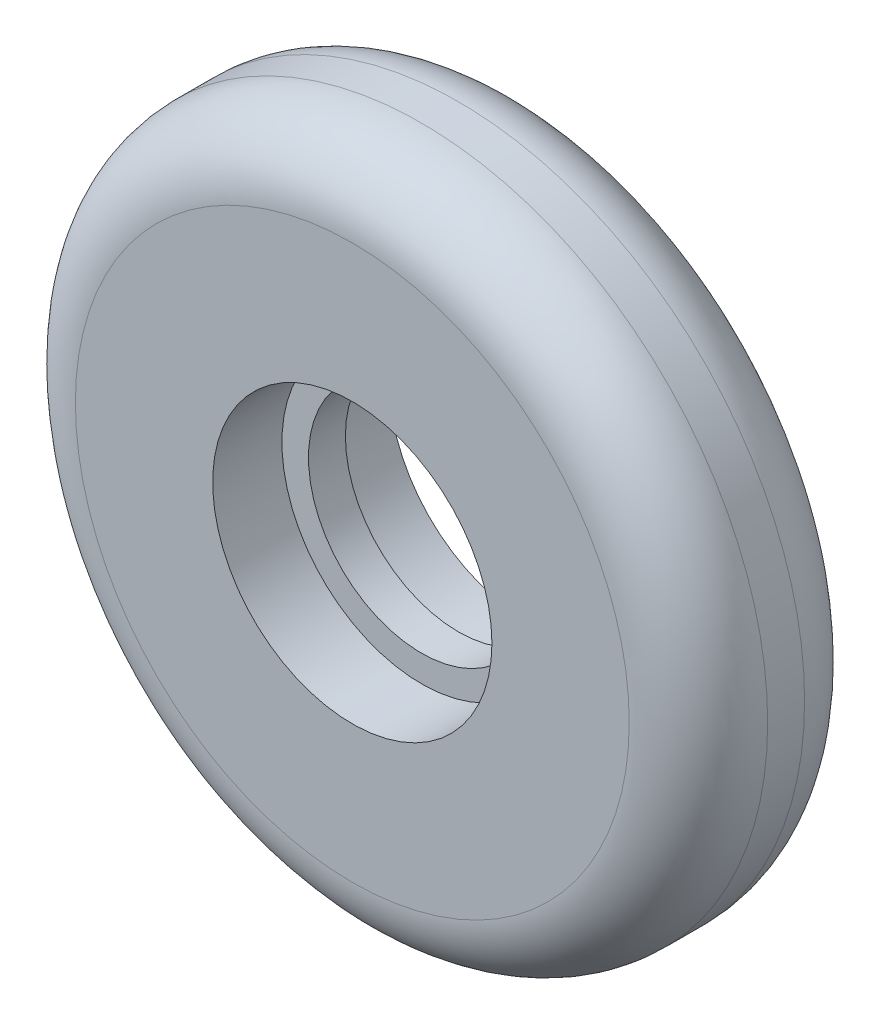
ISO-10303-21;
HEADER;
FILE_DESCRIPTION(('STEP AP214'),'2;1');
FILE_NAME('part.step','',(''),(''),'','','');
FILE_SCHEMA(('AUTOMOTIVE_DESIGN { 1 0 10303 214 1 1 1 1 }'));
ENDSEC;
DATA;
#1=APPLICATION_CONTEXT('core data for automotive mechanical design processes');
#2=APPLICATION_PROTOCOL_DEFINITION('international standard','automotive_design',2000,#1);
#3=PRODUCT_CONTEXT('',#1,'mechanical');
#4=PRODUCT('Part','Part','',(#3));
#5=PRODUCT_RELATED_PRODUCT_CATEGORY('part','',(#4));
#6=PRODUCT_DEFINITION_FORMATION('','',#4);
#7=PRODUCT_DEFINITION_CONTEXT('part definition',#1,'design');
#8=PRODUCT_DEFINITION('design','',#6,#7);
#9=PRODUCT_DEFINITION_SHAPE('','',#8);
#10=(LENGTH_UNIT() NAMED_UNIT(*) SI_UNIT(.MILLI.,.METRE.));
#11=(NAMED_UNIT(*) PLANE_ANGLE_UNIT() SI_UNIT($,.RADIAN.));
#12=(NAMED_UNIT(*) SI_UNIT($,.STERADIAN.) SOLID_ANGLE_UNIT());
#13=UNCERTAINTY_MEASURE_WITH_UNIT(LENGTH_MEASURE(1.E-05),#10,'distance_accuracy_value','');
#14=(GEOMETRIC_REPRESENTATION_CONTEXT(3) GLOBAL_UNCERTAINTY_ASSIGNED_CONTEXT((#13)) GLOBAL_UNIT_ASSIGNED_CONTEXT((#10,
#11,#12)) REPRESENTATION_CONTEXT('',''));
#15=CARTESIAN_POINT('',(0.,0.,0.));
#16=DIRECTION('',(0.,0.,1.));
#17=DIRECTION('',(1.,0.,0.));
#18=AXIS2_PLACEMENT_3D('',#15,#16,#17);
#19=CARTESIAN_POINT('',(0.,0.,7.6));
#20=DIRECTION('',(0.,0.,-1.));
#21=DIRECTION('',(-1.,0.,0.));
#22=AXIS2_PLACEMENT_3D('',#19,#20,#21);
#23=CYLINDRICAL_SURFACE('',#22,15.);
#24=CARTESIAN_POINT('',(0.,0.,3.));
#25=DIRECTION('',(0.,0.,1.));
#26=DIRECTION('',(1.,0.,0.));
#27=AXIS2_PLACEMENT_3D('',#24,#25,#26);
#28=CIRCLE('',#27,15.);
#29=CARTESIAN_POINT('',(-15.,0.,3.));
#30=VERTEX_POINT('',#29);
#31=EDGE_CURVE('E44',#30,#30,#28,.T.);
#32=CARTESIAN_POINT('',(0.,0.,4.6));
#33=DIRECTION('',(0.,0.,1.));
#34=DIRECTION('',(1.,0.,0.));
#35=AXIS2_PLACEMENT_3D('',#32,#33,#34);
#36=CIRCLE('',#35,15.);
#37=CARTESIAN_POINT('',(-15.,0.,4.6));
#38=VERTEX_POINT('',#37);
#39=EDGE_CURVE('E48',#38,#38,#36,.F.);
#40=CARTESIAN_POINT('',(-15.,0.,3.));
#41=CARTESIAN_POINT('',(-15.,0.,3.01666666666667));
#42=CARTESIAN_POINT('',(-15.,0.,3.03333333333333));
#43=CARTESIAN_POINT('',(-15.,0.,3.06666666666667));
#44=CARTESIAN_POINT('',(-15.,0.,3.08333333333333));
#45=CARTESIAN_POINT('',(-15.,0.,3.11666666666667));
#46=CARTESIAN_POINT('',(-15.,0.,3.13333333333333));
#47=CARTESIAN_POINT('',(-15.,0.,3.16666666666667));
#48=CARTESIAN_POINT('',(-15.,0.,3.18333333333333));
#49=CARTESIAN_POINT('',(-15.,0.,3.21666666666667));
#50=CARTESIAN_POINT('',(-15.,0.,3.23333333333333));
#51=CARTESIAN_POINT('',(-15.,0.,3.26666666666667));
#52=CARTESIAN_POINT('',(-15.,0.,3.28333333333333));
#53=CARTESIAN_POINT('',(-15.,0.,3.31666666666667));
#54=CARTESIAN_POINT('',(-15.,0.,3.33333333333333));
#55=CARTESIAN_POINT('',(-15.,0.,3.36666666666667));
#56=CARTESIAN_POINT('',(-15.,0.,3.38333333333333));
#57=CARTESIAN_POINT('',(-15.,0.,3.41666666666667));
#58=CARTESIAN_POINT('',(-15.,0.,3.43333333333333));
#59=CARTESIAN_POINT('',(-15.,0.,3.46666666666667));
#60=CARTESIAN_POINT('',(-15.,0.,3.48333333333333));
#61=CARTESIAN_POINT('',(-15.,0.,3.51666666666667));
#62=CARTESIAN_POINT('',(-15.,0.,3.53333333333333));
#63=CARTESIAN_POINT('',(-15.,0.,3.56666666666667));
#64=CARTESIAN_POINT('',(-15.,0.,3.58333333333333));
#65=CARTESIAN_POINT('',(-15.,0.,3.61666666666667));
#66=CARTESIAN_POINT('',(-15.,0.,3.63333333333333));
#67=CARTESIAN_POINT('',(-15.,0.,3.66666666666667));
#68=CARTESIAN_POINT('',(-15.,0.,3.68333333333333));
#69=CARTESIAN_POINT('',(-15.,0.,3.71666666666667));
#70=CARTESIAN_POINT('',(-15.,0.,3.73333333333333));
#71=CARTESIAN_POINT('',(-15.,0.,3.76666666666667));
#72=CARTESIAN_POINT('',(-15.,0.,3.78333333333333));
#73=CARTESIAN_POINT('',(-15.,0.,3.81666666666667));
#74=CARTESIAN_POINT('',(-15.,0.,3.83333333333333));
#75=CARTESIAN_POINT('',(-15.,0.,3.86666666666667));
#76=CARTESIAN_POINT('',(-15.,0.,3.88333333333333));
#77=CARTESIAN_POINT('',(-15.,0.,3.91666666666667));
#78=CARTESIAN_POINT('',(-15.,0.,3.93333333333333));
#79=CARTESIAN_POINT('',(-15.,0.,3.96666666666667));
#80=CARTESIAN_POINT('',(-15.,0.,3.98333333333333));
#81=CARTESIAN_POINT('',(-15.,0.,4.01666666666667));
#82=CARTESIAN_POINT('',(-15.,0.,4.03333333333333));
#83=CARTESIAN_POINT('',(-15.,0.,4.06666666666667));
#84=CARTESIAN_POINT('',(-15.,0.,4.08333333333333));
#85=CARTESIAN_POINT('',(-15.,0.,4.11666666666667));
#86=CARTESIAN_POINT('',(-15.,0.,4.13333333333333));
#87=CARTESIAN_POINT('',(-15.,0.,4.16666666666667));
#88=CARTESIAN_POINT('',(-15.,0.,4.18333333333333));
#89=CARTESIAN_POINT('',(-15.,0.,4.21666666666667));
#90=CARTESIAN_POINT('',(-15.,0.,4.23333333333333));
#91=CARTESIAN_POINT('',(-15.,0.,4.26666666666667));
#92=CARTESIAN_POINT('',(-15.,0.,4.28333333333333));
#93=CARTESIAN_POINT('',(-15.,0.,4.31666666666667));
#94=CARTESIAN_POINT('',(-15.,0.,4.33333333333333));
#95=CARTESIAN_POINT('',(-15.,0.,4.36666666666667));
#96=CARTESIAN_POINT('',(-15.,0.,4.38333333333333));
#97=CARTESIAN_POINT('',(-15.,0.,4.41666666666667));
#98=CARTESIAN_POINT('',(-15.,0.,4.43333333333333));
#99=CARTESIAN_POINT('',(-15.,0.,4.46666666666667));
#100=CARTESIAN_POINT('',(-15.,0.,4.48333333333333));
#101=CARTESIAN_POINT('',(-15.,0.,4.51666666666667));
#102=CARTESIAN_POINT('',(-15.,0.,4.53333333333333));
#103=CARTESIAN_POINT('',(-15.,0.,4.56666666666667));
#104=CARTESIAN_POINT('',(-15.,0.,4.58333333333333));
#105=CARTESIAN_POINT('',(-15.,0.,4.6));
#106=B_SPLINE_CURVE_WITH_KNOTS('',3,(#40,#41,#42,#43,#44,#45,#46,#47,#48,#49,#50,#51,#52,#53,
#54,#55,#56,#57,#58,#59,#60,#61,#62,#63,#64,#65,#66,#67,#68,#69,#70,#71,#72,#73,#74,#75,#76,#77,
#78,#79,#80,#81,#82,#83,#84,#85,#86,#87,#88,#89,#90,#91,#92,#93,#94,#95,#96,#97,#98,#99,#100,
#101,#102,#103,#104,#105),.UNSPECIFIED.,.F.,.F.,(4,2,2,2,2,2,2,2,2,2,2,2,2,2,2,2,2,2,2,2,2,2,2,
2,2,2,2,2,2,2,2,2,4),(0.,0.0499999999999997,0.1,0.15,0.200000000000001,0.25,0.3,0.35,0.4,0.45,
0.5,0.55,0.6,0.65,0.7,0.75,0.8,0.85,0.9,0.95,1.,1.05,1.1,1.15,1.2,1.25,1.3,1.35,1.4,1.45,1.5,
1.55,1.6),.UNSPECIFIED.);
#107=EDGE_CURVE('BSEAM33',#30,#38,#106,.T.);
#108=ORIENTED_EDGE('',*,*,#31,.T.);
#109=ORIENTED_EDGE('',*,*,#39,.T.);
#110=ORIENTED_EDGE('',*,*,#107,.T.);
#111=ORIENTED_EDGE('',*,*,#107,.F.);
#112=EDGE_LOOP('',(#108,#110,#109,#111));
#113=FACE_BOUND('',#112,.T.);
#114=ADVANCED_FACE('F33',(#113),#23,.T.);
#115=CARTESIAN_POINT('',(0.,0.,7.6));
#116=DIRECTION('',(0.,0.,1.));
#117=DIRECTION('',(1.,0.,0.));
#118=AXIS2_PLACEMENT_3D('',#115,#116,#117);
#119=PLANE('',#118);
#120=CARTESIAN_POINT('',(0.,0.,7.6));
#121=DIRECTION('',(0.,0.,1.));
#122=DIRECTION('',(1.,0.,0.));
#123=AXIS2_PLACEMENT_3D('',#120,#121,#122);
#124=CIRCLE('',#123,12.);
#125=CARTESIAN_POINT('',(12.,0.,7.6));
#126=VERTEX_POINT('',#125);
#127=EDGE_CURVE('E10',#126,#126,#124,.T.);
#128=ORIENTED_EDGE('',*,*,#127,.T.);
#129=EDGE_LOOP('',(#128));
#130=FACE_BOUND('',#129,.T.);
#131=CARTESIAN_POINT('',(0.,0.,7.6));
#132=DIRECTION('',(0.,0.,1.));
#133=DIRECTION('',(1.,0.,0.));
#134=AXIS2_PLACEMENT_3D('',#131,#132,#133);
#135=CIRCLE('',#134,6.05);
#136=CARTESIAN_POINT('',(6.05,0.,7.6));
#137=VERTEX_POINT('',#136);
#138=EDGE_CURVE('E59',#137,#137,#135,.T.);
#139=ORIENTED_EDGE('',*,*,#138,.F.);
#140=EDGE_LOOP('',(#139));
#141=FACE_BOUND('',#140,.T.);
#142=ADVANCED_FACE('F88',(#130,#141),#119,.T.);
#143=CARTESIAN_POINT('',(0.,0.,0.));
#144=DIRECTION('',(0.,0.,1.));
#145=DIRECTION('',(1.,0.,0.));
#146=AXIS2_PLACEMENT_3D('',#143,#144,#145);
#147=PLANE('',#146);
#148=CARTESIAN_POINT('',(0.,0.,0.));
#149=DIRECTION('',(0.,0.,1.));
#150=DIRECTION('',(1.,0.,0.));
#151=AXIS2_PLACEMENT_3D('',#148,#149,#150);
#152=CIRCLE('',#151,12.);
#153=CARTESIAN_POINT('',(12.,0.,0.));
#154=VERTEX_POINT('',#153);
#155=EDGE_CURVE('E40',#154,#154,#152,.F.);
#156=ORIENTED_EDGE('',*,*,#155,.T.);
#157=EDGE_LOOP('',(#156));
#158=FACE_BOUND('',#157,.T.);
#159=CARTESIAN_POINT('',(0.,0.,0.));
#160=DIRECTION('',(0.,0.,-1.));
#161=DIRECTION('',(-1.,0.,0.));
#162=AXIS2_PLACEMENT_3D('',#159,#160,#161);
#163=CIRCLE('',#162,6.);
#164=CARTESIAN_POINT('',(-6.,0.,0.));
#165=VERTEX_POINT('',#164);
#166=EDGE_CURVE('E57',#165,#165,#163,.T.);
#167=ORIENTED_EDGE('',*,*,#166,.F.);
#168=EDGE_LOOP('',(#167));
#169=FACE_BOUND('',#168,.T.);
#170=ADVANCED_FACE('F84',(#158,#169),#147,.F.);
#171=CARTESIAN_POINT('',(0.,0.,4.6));
#172=DIRECTION('',(0.,0.,1.));
#173=DIRECTION('',(1.,0.,0.));
#174=AXIS2_PLACEMENT_3D('',#171,#172,#173);
#175=CYLINDRICAL_SURFACE('',#174,6.05);
#176=CARTESIAN_POINT('',(0.,0.,4.6));
#177=DIRECTION('',(0.,0.,1.));
#178=DIRECTION('',(1.,0.,0.));
#179=AXIS2_PLACEMENT_3D('',#176,#177,#178);
#180=CIRCLE('',#179,6.05);
#181=CARTESIAN_POINT('',(6.05,0.,4.6));
#182=VERTEX_POINT('',#181);
#183=EDGE_CURVE('E53',#182,#182,#180,.T.);
#184=ORIENTED_EDGE('',*,*,#183,.F.);
#185=EDGE_LOOP('',(#184));
#186=FACE_BOUND('',#185,.T.);
#187=ORIENTED_EDGE('',*,*,#138,.T.);
#188=EDGE_LOOP('',(#187));
#189=FACE_BOUND('',#188,.T.);
#190=ADVANCED_FACE('F78',(#186,#189),#175,.F.);
#191=CARTESIAN_POINT('',(0.,0.,4.6));
#192=DIRECTION('',(0.,0.,1.));
#193=DIRECTION('',(1.,0.,0.));
#194=AXIS2_PLACEMENT_3D('',#191,#192,#193);
#195=PLANE('',#194);
#196=CARTESIAN_POINT('',(0.,0.,4.6));
#197=DIRECTION('',(0.,0.,1.));
#198=DIRECTION('',(1.,0.,0.));
#199=AXIS2_PLACEMENT_3D('',#196,#197,#198);
#200=CIRCLE('',#199,4.9);
#201=CARTESIAN_POINT('',(4.9,0.,4.6));
#202=VERTEX_POINT('',#201);
#203=EDGE_CURVE('E58',#202,#202,#200,.T.);
#204=ORIENTED_EDGE('',*,*,#203,.F.);
#205=EDGE_LOOP('',(#204));
#206=FACE_BOUND('',#205,.T.);
#207=ORIENTED_EDGE('',*,*,#183,.T.);
#208=EDGE_LOOP('',(#207));
#209=FACE_BOUND('',#208,.T.);
#210=ADVANCED_FACE('F74',(#206,#209),#195,.T.);
#211=CARTESIAN_POINT('',(0.,0.,3.));
#212=DIRECTION('',(0.,0.,-1.));
#213=DIRECTION('',(-1.,0.,0.));
#214=AXIS2_PLACEMENT_3D('',#211,#212,#213);
#215=CYLINDRICAL_SURFACE('',#214,6.);
#216=CARTESIAN_POINT('',(0.,0.,3.));
#217=DIRECTION('',(0.,0.,-1.));
#218=DIRECTION('',(-1.,0.,0.));
#219=AXIS2_PLACEMENT_3D('',#216,#217,#218);
#220=CIRCLE('',#219,6.);
#221=CARTESIAN_POINT('',(-6.,0.,3.));
#222=VERTEX_POINT('',#221);
#223=EDGE_CURVE('E62',#222,#222,#220,.T.);
#224=ORIENTED_EDGE('',*,*,#223,.F.);
#225=EDGE_LOOP('',(#224));
#226=FACE_BOUND('',#225,.T.);
#227=ORIENTED_EDGE('',*,*,#166,.T.);
#228=EDGE_LOOP('',(#227));
#229=FACE_BOUND('',#228,.T.);
#230=ADVANCED_FACE('F77',(#226,#229),#215,.F.);
#231=CARTESIAN_POINT('',(0.,0.,3.));
#232=DIRECTION('',(0.,0.,-1.));
#233=DIRECTION('',(-1.,0.,0.));
#234=AXIS2_PLACEMENT_3D('',#231,#232,#233);
#235=PLANE('',#234);
#236=CARTESIAN_POINT('',(0.,0.,3.));
#237=DIRECTION('',(0.,0.,-1.));
#238=DIRECTION('',(-1.,0.,0.));
#239=AXIS2_PLACEMENT_3D('',#236,#237,#238);
#240=CIRCLE('',#239,4.9);
#241=CARTESIAN_POINT('',(-4.9,0.,3.));
#242=VERTEX_POINT('',#241);
#243=EDGE_CURVE('E54',#242,#242,#240,.T.);
#244=ORIENTED_EDGE('',*,*,#243,.F.);
#245=EDGE_LOOP('',(#244));
#246=FACE_BOUND('',#245,.T.);
#247=ORIENTED_EDGE('',*,*,#223,.T.);
#248=EDGE_LOOP('',(#247));
#249=FACE_BOUND('',#248,.T.);
#250=ADVANCED_FACE('F106',(#246,#249),#235,.T.);
#251=CARTESIAN_POINT('',(0.,0.,0.));
#252=DIRECTION('',(0.,0.,1.));
#253=DIRECTION('',(1.,0.,0.));
#254=AXIS2_PLACEMENT_3D('',#251,#252,#253);
#255=CYLINDRICAL_SURFACE('',#254,4.9);
#256=ORIENTED_EDGE('',*,*,#243,.T.);
#257=EDGE_LOOP('',(#256));
#258=FACE_BOUND('',#257,.T.);
#259=ORIENTED_EDGE('',*,*,#203,.T.);
#260=EDGE_LOOP('',(#259));
#261=FACE_BOUND('',#260,.T.);
#262=ADVANCED_FACE('F72',(#258,#261),#255,.F.);
#263=CARTESIAN_POINT('',(0.,0.,3.));
#264=DIRECTION('',(0.,0.,1.));
#265=DIRECTION('',(1.,0.,0.));
#266=AXIS2_PLACEMENT_3D('',#263,#264,#265);
#267=TOROIDAL_SURFACE('',#266,12.,3.);
#268=ORIENTED_EDGE('',*,*,#155,.F.);
#269=EDGE_LOOP('',(#268));
#270=FACE_BOUND('',#269,.T.);
#271=ORIENTED_EDGE('',*,*,#31,.F.);
#272=EDGE_LOOP('',(#271));
#273=FACE_BOUND('',#272,.T.);
#274=ADVANCED_FACE('F98',(#270,#273),#267,.T.);
#275=CARTESIAN_POINT('',(0.,0.,4.6));
#276=DIRECTION('',(0.,0.,1.));
#277=DIRECTION('',(1.,0.,0.));
#278=AXIS2_PLACEMENT_3D('',#275,#276,#277);
#279=TOROIDAL_SURFACE('',#278,12.,3.);
#280=ORIENTED_EDGE('',*,*,#39,.F.);
#281=EDGE_LOOP('',(#280));
#282=FACE_BOUND('',#281,.T.);
#283=ORIENTED_EDGE('',*,*,#127,.F.);
#284=EDGE_LOOP('',(#283));
#285=FACE_BOUND('',#284,.T.);
#286=ADVANCED_FACE('F35',(#282,#285),#279,.T.);
#287=CLOSED_SHELL('',(#114,#142,#170,#190,#210,#230,#250,#262,#274,#286));
#288=MANIFOLD_SOLID_BREP('B2',#287);
#289=ADVANCED_BREP_SHAPE_REPRESENTATION('',(#18,#288),#14);
#290=SHAPE_DEFINITION_REPRESENTATION(#9,#289);
ENDSEC;
END-ISO-10303-21;
